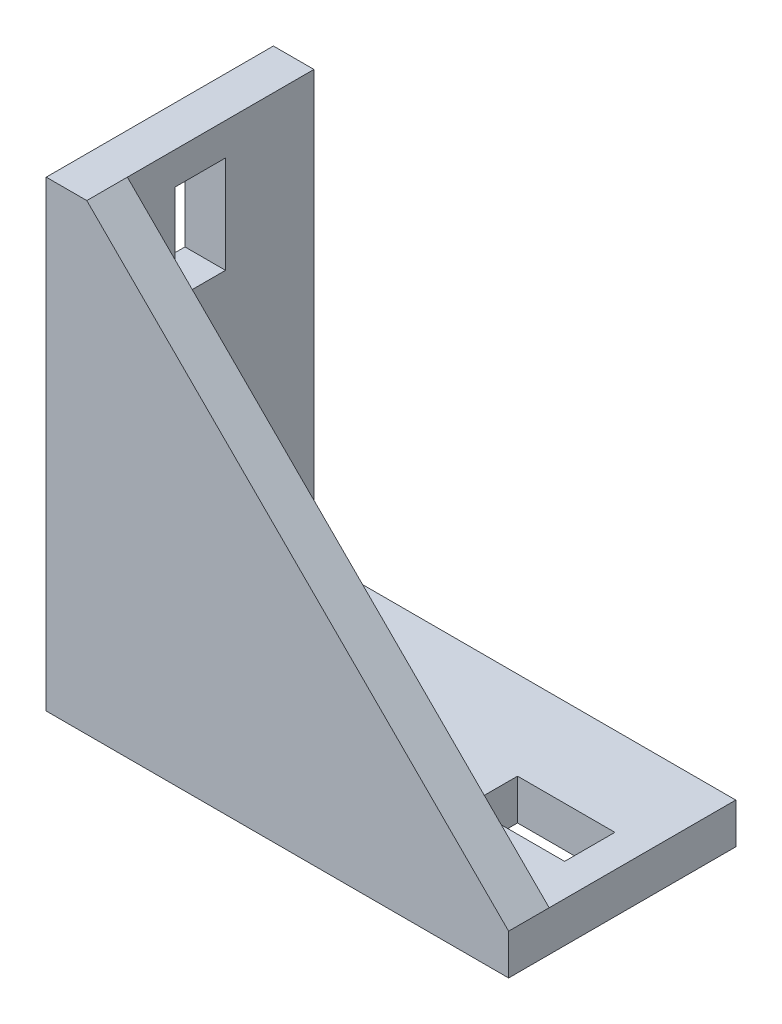
ISO-10303-21;
HEADER;
FILE_DESCRIPTION(('STEP AP214'),'2;1');
FILE_NAME('part.step','',(''),(''),'','','');
FILE_SCHEMA(('AUTOMOTIVE_DESIGN { 1 0 10303 214 1 1 1 1 }'));
ENDSEC;
DATA;
#1=APPLICATION_CONTEXT('core data for automotive mechanical design processes');
#2=APPLICATION_PROTOCOL_DEFINITION('international standard','automotive_design',2000,#1);
#3=PRODUCT_CONTEXT('',#1,'mechanical');
#4=PRODUCT('Part','Part','',(#3));
#5=PRODUCT_RELATED_PRODUCT_CATEGORY('part','',(#4));
#6=PRODUCT_DEFINITION_FORMATION('','',#4);
#7=PRODUCT_DEFINITION_CONTEXT('part definition',#1,'design');
#8=PRODUCT_DEFINITION('design','',#6,#7);
#9=PRODUCT_DEFINITION_SHAPE('','',#8);
#10=(LENGTH_UNIT() NAMED_UNIT(*) SI_UNIT(.MILLI.,.METRE.));
#11=(NAMED_UNIT(*) PLANE_ANGLE_UNIT() SI_UNIT($,.RADIAN.));
#12=(NAMED_UNIT(*) SI_UNIT($,.STERADIAN.) SOLID_ANGLE_UNIT());
#13=UNCERTAINTY_MEASURE_WITH_UNIT(LENGTH_MEASURE(1.E-05),#10,'distance_accuracy_value','');
#14=(GEOMETRIC_REPRESENTATION_CONTEXT(3) GLOBAL_UNCERTAINTY_ASSIGNED_CONTEXT((#13)) GLOBAL_UNIT_ASSIGNED_CONTEXT((#10,
#11,#12)) REPRESENTATION_CONTEXT('',''));
#15=CARTESIAN_POINT('',(0.,0.,0.));
#16=DIRECTION('',(0.,0.,1.));
#17=DIRECTION('',(1.,0.,0.));
#18=AXIS2_PLACEMENT_3D('',#15,#16,#17);
#19=CARTESIAN_POINT('',(5.00000000000001,5.,28.));
#20=DIRECTION('',(0.,-1.,0.));
#21=DIRECTION('',(0.,0.,-1.));
#22=AXIS2_PLACEMENT_3D('',#19,#20,#21);
#23=PLANE('',#22);
#24=DIRECTION('',(1.,0.,0.));
#25=VECTOR('',#24,1.);
#26=CARTESIAN_POINT('',(21.,5.,17.1));
#27=LINE('',#26,#25);
#28=CARTESIAN_POINT('',(9.00000000000001,5.,17.1));
#29=VERTEX_POINT('',#28);
#30=CARTESIAN_POINT('',(21.,5.,17.1));
#31=VERTEX_POINT('',#30);
#32=EDGE_CURVE('E214',#29,#31,#27,.T.);
#33=ORIENTED_EDGE('',*,*,#32,.F.);
#34=DIRECTION('',(0.,0.,1.));
#35=VECTOR('',#34,1.);
#36=CARTESIAN_POINT('',(9.00000000000001,5.,17.1));
#37=LINE('',#36,#35);
#38=CARTESIAN_POINT('',(9.00000000000001,5.,10.9));
#39=VERTEX_POINT('',#38);
#40=EDGE_CURVE('E47',#39,#29,#37,.T.);
#41=ORIENTED_EDGE('',*,*,#40,.F.);
#42=DIRECTION('',(-1.,0.,0.));
#43=VECTOR('',#42,1.);
#44=CARTESIAN_POINT('',(21.,5.,10.9));
#45=LINE('',#44,#43);
#46=CARTESIAN_POINT('',(21.,5.,10.9));
#47=VERTEX_POINT('',#46);
#48=EDGE_CURVE('E205',#47,#39,#45,.T.);
#49=ORIENTED_EDGE('',*,*,#48,.F.);
#50=DIRECTION('',(0.,0.,-1.));
#51=VECTOR('',#50,1.);
#52=CARTESIAN_POINT('',(21.,5.,17.1));
#53=LINE('',#52,#51);
#54=EDGE_CURVE('E208',#31,#47,#53,.T.);
#55=ORIENTED_EDGE('',*,*,#54,.F.);
#56=EDGE_LOOP('',(#33,#41,#49,#55));
#57=FACE_BOUND('',#56,.T.);
#58=DIRECTION('',(1.,0.,0.));
#59=VECTOR('',#58,1.);
#60=CARTESIAN_POINT('',(53.,5.,17.1));
#61=LINE('',#60,#59);
#62=CARTESIAN_POINT('',(41.,5.,17.1));
#63=VERTEX_POINT('',#62);
#64=CARTESIAN_POINT('',(53.,5.,17.1));
#65=VERTEX_POINT('',#64);
#66=EDGE_CURVE('E239',#63,#65,#61,.T.);
#67=ORIENTED_EDGE('',*,*,#66,.F.);
#68=DIRECTION('',(0.,0.,1.));
#69=VECTOR('',#68,1.);
#70=CARTESIAN_POINT('',(41.,5.,17.1));
#71=LINE('',#70,#69);
#72=CARTESIAN_POINT('',(41.,5.,10.9));
#73=VERTEX_POINT('',#72);
#74=EDGE_CURVE('E220',#73,#63,#71,.T.);
#75=ORIENTED_EDGE('',*,*,#74,.F.);
#76=DIRECTION('',(-1.,0.,0.));
#77=VECTOR('',#76,1.);
#78=CARTESIAN_POINT('',(53.,5.,10.9));
#79=LINE('',#78,#77);
#80=CARTESIAN_POINT('',(53.,5.,10.9));
#81=VERTEX_POINT('',#80);
#82=EDGE_CURVE('E228',#81,#73,#79,.T.);
#83=ORIENTED_EDGE('',*,*,#82,.F.);
#84=DIRECTION('',(0.,0.,-1.));
#85=VECTOR('',#84,1.);
#86=CARTESIAN_POINT('',(53.,5.,17.1));
#87=LINE('',#86,#85);
#88=EDGE_CURVE('E242',#65,#81,#87,.T.);
#89=ORIENTED_EDGE('',*,*,#88,.F.);
#90=EDGE_LOOP('',(#67,#75,#83,#89));
#91=FACE_BOUND('',#90,.T.);
#92=DIRECTION('',(1.,0.,0.));
#93=VECTOR('',#92,1.);
#94=CARTESIAN_POINT('',(5.00000000000001,5.,23.));
#95=LINE('',#94,#93);
#96=CARTESIAN_POINT('',(5.00000000000001,5.,23.));
#97=VERTEX_POINT('',#96);
#98=CARTESIAN_POINT('',(57.,5.,23.));
#99=VERTEX_POINT('',#98);
#100=EDGE_CURVE('E323',#97,#99,#95,.T.);
#101=ORIENTED_EDGE('',*,*,#100,.T.);
#102=DIRECTION('',(0.,0.,-1.));
#103=VECTOR('',#102,1.);
#104=CARTESIAN_POINT('',(57.,5.,28.));
#105=LINE('',#104,#103);
#106=CARTESIAN_POINT('',(57.,5.,0.));
#107=VERTEX_POINT('',#106);
#108=EDGE_CURVE('E366',#99,#107,#105,.T.);
#109=ORIENTED_EDGE('',*,*,#108,.T.);
#110=DIRECTION('',(-1.,0.,0.));
#111=VECTOR('',#110,1.);
#112=CARTESIAN_POINT('',(5.00000000000001,5.,0.));
#113=LINE('',#112,#111);
#114=CARTESIAN_POINT('',(5.00000000000001,5.,0.));
#115=VERTEX_POINT('',#114);
#116=EDGE_CURVE('E351',#107,#115,#113,.T.);
#117=ORIENTED_EDGE('',*,*,#116,.T.);
#118=DIRECTION('',(0.,0.,-1.));
#119=VECTOR('',#118,1.);
#120=CARTESIAN_POINT('',(5.00000000000001,5.,28.));
#121=LINE('',#120,#119);
#122=EDGE_CURVE('E364',#97,#115,#121,.T.);
#123=ORIENTED_EDGE('',*,*,#122,.F.);
#124=EDGE_LOOP('',(#101,#109,#117,#123));
#125=FACE_BOUND('',#124,.T.);
#126=ADVANCED_FACE('F32',(#57,#91,#125),#23,.F.);
#127=CARTESIAN_POINT('',(5.,57.,28.));
#128=DIRECTION('',(-1.,0.,0.));
#129=DIRECTION('',(0.,-1.,0.));
#130=AXIS2_PLACEMENT_3D('',#127,#128,#129);
#131=PLANE('',#130);
#132=DIRECTION('',(0.,0.,1.));
#133=VECTOR('',#132,1.);
#134=CARTESIAN_POINT('',(5.,21.,17.1));
#135=LINE('',#134,#133);
#136=CARTESIAN_POINT('',(5.,21.,10.9));
#137=VERTEX_POINT('',#136);
#138=CARTESIAN_POINT('',(5.,21.,17.1));
#139=VERTEX_POINT('',#138);
#140=EDGE_CURVE('E271',#137,#139,#135,.T.);
#141=ORIENTED_EDGE('',*,*,#140,.F.);
#142=DIRECTION('',(0.,1.,0.));
#143=VECTOR('',#142,1.);
#144=CARTESIAN_POINT('',(5.00000000000001,9.,10.9));
#145=LINE('',#144,#143);
#146=CARTESIAN_POINT('',(5.00000000000001,9.,10.9));
#147=VERTEX_POINT('',#146);
#148=EDGE_CURVE('E249',#147,#137,#145,.T.);
#149=ORIENTED_EDGE('',*,*,#148,.F.);
#150=DIRECTION('',(0.,0.,-1.));
#151=VECTOR('',#150,1.);
#152=CARTESIAN_POINT('',(5.00000000000001,9.,17.1));
#153=LINE('',#152,#151);
#154=CARTESIAN_POINT('',(5.00000000000001,9.,17.1));
#155=VERTEX_POINT('',#154);
#156=EDGE_CURVE('E260',#155,#147,#153,.T.);
#157=ORIENTED_EDGE('',*,*,#156,.F.);
#158=DIRECTION('',(0.,-1.,0.));
#159=VECTOR('',#158,1.);
#160=CARTESIAN_POINT('',(5.00000000000001,9.,17.1));
#161=LINE('',#160,#159);
#162=EDGE_CURVE('E274',#139,#155,#161,.T.);
#163=ORIENTED_EDGE('',*,*,#162,.F.);
#164=EDGE_LOOP('',(#141,#149,#157,#163));
#165=FACE_BOUND('',#164,.T.);
#166=DIRECTION('',(0.,0.,1.));
#167=VECTOR('',#166,1.);
#168=CARTESIAN_POINT('',(5.,53.,17.1));
#169=LINE('',#168,#167);
#170=CARTESIAN_POINT('',(5.,53.,10.9));
#171=VERTEX_POINT('',#170);
#172=CARTESIAN_POINT('',(5.,53.,17.1));
#173=VERTEX_POINT('',#172);
#174=EDGE_CURVE('E303',#171,#173,#169,.T.);
#175=ORIENTED_EDGE('',*,*,#174,.F.);
#176=DIRECTION('',(0.,1.,0.));
#177=VECTOR('',#176,1.);
#178=CARTESIAN_POINT('',(5.,41.,10.9));
#179=LINE('',#178,#177);
#180=CARTESIAN_POINT('',(5.,41.,10.9));
#181=VERTEX_POINT('',#180);
#182=EDGE_CURVE('E281',#181,#171,#179,.T.);
#183=ORIENTED_EDGE('',*,*,#182,.F.);
#184=DIRECTION('',(0.,0.,-1.));
#185=VECTOR('',#184,1.);
#186=CARTESIAN_POINT('',(5.,41.,17.1));
#187=LINE('',#186,#185);
#188=CARTESIAN_POINT('',(5.,41.,17.1));
#189=VERTEX_POINT('',#188);
#190=EDGE_CURVE('E292',#189,#181,#187,.T.);
#191=ORIENTED_EDGE('',*,*,#190,.F.);
#192=DIRECTION('',(0.,-1.,0.));
#193=VECTOR('',#192,1.);
#194=CARTESIAN_POINT('',(5.,41.,17.1));
#195=LINE('',#194,#193);
#196=EDGE_CURVE('E306',#173,#189,#195,.T.);
#197=ORIENTED_EDGE('',*,*,#196,.F.);
#198=EDGE_LOOP('',(#175,#183,#191,#197));
#199=FACE_BOUND('',#198,.T.);
#200=DIRECTION('',(0.,-1.,0.));
#201=VECTOR('',#200,1.);
#202=CARTESIAN_POINT('',(5.,57.,23.));
#203=LINE('',#202,#201);
#204=CARTESIAN_POINT('',(5.,57.,23.));
#205=VERTEX_POINT('',#204);
#206=EDGE_CURVE('E320',#205,#97,#203,.T.);
#207=ORIENTED_EDGE('',*,*,#206,.T.);
#208=ORIENTED_EDGE('',*,*,#122,.T.);
#209=DIRECTION('',(0.,1.,0.));
#210=VECTOR('',#209,1.);
#211=CARTESIAN_POINT('',(5.,57.,0.));
#212=LINE('',#211,#210);
#213=CARTESIAN_POINT('',(5.,57.,0.));
#214=VERTEX_POINT('',#213);
#215=EDGE_CURVE('E354',#115,#214,#212,.T.);
#216=ORIENTED_EDGE('',*,*,#215,.T.);
#217=DIRECTION('',(0.,0.,-1.));
#218=VECTOR('',#217,1.);
#219=CARTESIAN_POINT('',(5.,57.,28.));
#220=LINE('',#219,#218);
#221=EDGE_CURVE('E360',#205,#214,#220,.T.);
#222=ORIENTED_EDGE('',*,*,#221,.F.);
#223=EDGE_LOOP('',(#207,#208,#216,#222));
#224=FACE_BOUND('',#223,.T.);
#225=ADVANCED_FACE('F392',(#165,#199,#224),#131,.F.);
#226=CARTESIAN_POINT('',(0.,0.,28.));
#227=DIRECTION('',(1.,0.,0.));
#228=DIRECTION('',(0.,0.,-1.));
#229=AXIS2_PLACEMENT_3D('',#226,#227,#228);
#230=PLANE('',#229);
#231=DIRECTION('',(0.,0.,-1.));
#232=VECTOR('',#231,1.);
#233=CARTESIAN_POINT('',(0.,9.,17.1));
#234=LINE('',#233,#232);
#235=CARTESIAN_POINT('',(0.,9.,17.1));
#236=VERTEX_POINT('',#235);
#237=CARTESIAN_POINT('',(0.,9.,10.9));
#238=VERTEX_POINT('',#237);
#239=EDGE_CURVE('E266',#236,#238,#234,.T.);
#240=ORIENTED_EDGE('',*,*,#239,.T.);
#241=DIRECTION('',(0.,1.,0.));
#242=VECTOR('',#241,1.);
#243=CARTESIAN_POINT('',(0.,9.,10.9));
#244=LINE('',#243,#242);
#245=CARTESIAN_POINT('',(0.,21.,10.9));
#246=VERTEX_POINT('',#245);
#247=EDGE_CURVE('E256',#238,#246,#244,.T.);
#248=ORIENTED_EDGE('',*,*,#247,.T.);
#249=DIRECTION('',(0.,0.,1.));
#250=VECTOR('',#249,1.);
#251=CARTESIAN_POINT('',(0.,21.,17.1));
#252=LINE('',#251,#250);
#253=CARTESIAN_POINT('',(0.,21.,17.1));
#254=VERTEX_POINT('',#253);
#255=EDGE_CURVE('E259',#246,#254,#252,.T.);
#256=ORIENTED_EDGE('',*,*,#255,.T.);
#257=DIRECTION('',(0.,-1.,0.));
#258=VECTOR('',#257,1.);
#259=CARTESIAN_POINT('',(0.,9.,17.1));
#260=LINE('',#259,#258);
#261=EDGE_CURVE('E263',#254,#236,#260,.T.);
#262=ORIENTED_EDGE('',*,*,#261,.T.);
#263=EDGE_LOOP('',(#240,#248,#256,#262));
#264=FACE_BOUND('',#263,.T.);
#265=DIRECTION('',(0.,0.,-1.));
#266=VECTOR('',#265,1.);
#267=CARTESIAN_POINT('',(0.,41.,17.1));
#268=LINE('',#267,#266);
#269=CARTESIAN_POINT('',(0.,41.,17.1));
#270=VERTEX_POINT('',#269);
#271=CARTESIAN_POINT('',(0.,41.,10.9));
#272=VERTEX_POINT('',#271);
#273=EDGE_CURVE('E298',#270,#272,#268,.T.);
#274=ORIENTED_EDGE('',*,*,#273,.T.);
#275=DIRECTION('',(0.,1.,0.));
#276=VECTOR('',#275,1.);
#277=CARTESIAN_POINT('',(0.,41.,10.9));
#278=LINE('',#277,#276);
#279=CARTESIAN_POINT('',(0.,53.,10.9));
#280=VERTEX_POINT('',#279);
#281=EDGE_CURVE('E288',#272,#280,#278,.T.);
#282=ORIENTED_EDGE('',*,*,#281,.T.);
#283=DIRECTION('',(0.,0.,1.));
#284=VECTOR('',#283,1.);
#285=CARTESIAN_POINT('',(0.,53.,17.1));
#286=LINE('',#285,#284);
#287=CARTESIAN_POINT('',(0.,53.,17.1));
#288=VERTEX_POINT('',#287);
#289=EDGE_CURVE('E291',#280,#288,#286,.T.);
#290=ORIENTED_EDGE('',*,*,#289,.T.);
#291=DIRECTION('',(0.,-1.,0.));
#292=VECTOR('',#291,1.);
#293=CARTESIAN_POINT('',(0.,41.,17.1));
#294=LINE('',#293,#292);
#295=EDGE_CURVE('E295',#288,#270,#294,.T.);
#296=ORIENTED_EDGE('',*,*,#295,.T.);
#297=EDGE_LOOP('',(#274,#282,#290,#296));
#298=FACE_BOUND('',#297,.T.);
#299=DIRECTION('',(0.,-1.,0.));
#300=VECTOR('',#299,1.);
#301=CARTESIAN_POINT('',(0.,0.,0.));
#302=LINE('',#301,#300);
#303=CARTESIAN_POINT('',(0.,57.,0.));
#304=VERTEX_POINT('',#303);
#305=CARTESIAN_POINT('',(0.,0.,0.));
#306=VERTEX_POINT('',#305);
#307=EDGE_CURVE('E329',#304,#306,#302,.T.);
#308=ORIENTED_EDGE('',*,*,#307,.T.);
#309=DIRECTION('',(0.,0.,-1.));
#310=VECTOR('',#309,1.);
#311=CARTESIAN_POINT('',(0.,0.,28.));
#312=LINE('',#311,#310);
#313=CARTESIAN_POINT('',(0.,0.,28.));
#314=VERTEX_POINT('',#313);
#315=EDGE_CURVE('E11',#314,#306,#312,.T.);
#316=ORIENTED_EDGE('',*,*,#315,.F.);
#317=DIRECTION('',(0.,-1.,0.));
#318=VECTOR('',#317,1.);
#319=CARTESIAN_POINT('',(0.,0.,28.));
#320=LINE('',#319,#318);
#321=CARTESIAN_POINT('',(0.,57.,28.));
#322=VERTEX_POINT('',#321);
#323=EDGE_CURVE('E332',#322,#314,#320,.T.);
#324=ORIENTED_EDGE('',*,*,#323,.F.);
#325=DIRECTION('',(0.,0.,-1.));
#326=VECTOR('',#325,1.);
#327=CARTESIAN_POINT('',(0.,57.,28.));
#328=LINE('',#327,#326);
#329=EDGE_CURVE('E343',#322,#304,#328,.T.);
#330=ORIENTED_EDGE('',*,*,#329,.T.);
#331=EDGE_LOOP('',(#308,#316,#324,#330));
#332=FACE_BOUND('',#331,.T.);
#333=ADVANCED_FACE('F34',(#264,#298,#332),#230,.F.);
#334=CARTESIAN_POINT('',(0.,0.,28.));
#335=DIRECTION('',(0.,1.,0.));
#336=DIRECTION('',(0.,0.,1.));
#337=AXIS2_PLACEMENT_3D('',#334,#335,#336);
#338=PLANE('',#337);
#339=DIRECTION('',(-1.,0.,0.));
#340=VECTOR('',#339,1.);
#341=CARTESIAN_POINT('',(21.,0.,10.9));
#342=LINE('',#341,#340);
#343=CARTESIAN_POINT('',(21.,0.,10.9));
#344=VERTEX_POINT('',#343);
#345=CARTESIAN_POINT('',(9.00000000000001,0.,10.9));
#346=VERTEX_POINT('',#345);
#347=EDGE_CURVE('E195',#344,#346,#342,.T.);
#348=ORIENTED_EDGE('',*,*,#347,.T.);
#349=DIRECTION('',(0.,0.,1.));
#350=VECTOR('',#349,1.);
#351=CARTESIAN_POINT('',(9.00000000000001,0.,17.1));
#352=LINE('',#351,#350);
#353=CARTESIAN_POINT('',(9.00000000000001,0.,17.1));
#354=VERTEX_POINT('',#353);
#355=EDGE_CURVE('E189',#346,#354,#352,.T.);
#356=ORIENTED_EDGE('',*,*,#355,.T.);
#357=DIRECTION('',(1.,0.,0.));
#358=VECTOR('',#357,1.);
#359=CARTESIAN_POINT('',(21.,0.,17.1));
#360=LINE('',#359,#358);
#361=CARTESIAN_POINT('',(21.,0.,17.1));
#362=VERTEX_POINT('',#361);
#363=EDGE_CURVE('E198',#354,#362,#360,.T.);
#364=ORIENTED_EDGE('',*,*,#363,.T.);
#365=DIRECTION('',(0.,0.,-1.));
#366=VECTOR('',#365,1.);
#367=CARTESIAN_POINT('',(21.,0.,17.1));
#368=LINE('',#367,#366);
#369=EDGE_CURVE('E55',#362,#344,#368,.T.);
#370=ORIENTED_EDGE('',*,*,#369,.T.);
#371=EDGE_LOOP('',(#348,#356,#364,#370));
#372=FACE_BOUND('',#371,.T.);
#373=DIRECTION('',(-1.,0.,0.));
#374=VECTOR('',#373,1.);
#375=CARTESIAN_POINT('',(53.,0.,10.9));
#376=LINE('',#375,#374);
#377=CARTESIAN_POINT('',(53.,0.,10.9));
#378=VERTEX_POINT('',#377);
#379=CARTESIAN_POINT('',(41.,0.,10.9));
#380=VERTEX_POINT('',#379);
#381=EDGE_CURVE('E234',#378,#380,#376,.T.);
#382=ORIENTED_EDGE('',*,*,#381,.T.);
#383=DIRECTION('',(0.,0.,1.));
#384=VECTOR('',#383,1.);
#385=CARTESIAN_POINT('',(41.,0.,17.1));
#386=LINE('',#385,#384);
#387=CARTESIAN_POINT('',(41.,0.,17.1));
#388=VERTEX_POINT('',#387);
#389=EDGE_CURVE('E224',#380,#388,#386,.T.);
#390=ORIENTED_EDGE('',*,*,#389,.T.);
#391=DIRECTION('',(1.,0.,0.));
#392=VECTOR('',#391,1.);
#393=CARTESIAN_POINT('',(53.,0.,17.1));
#394=LINE('',#393,#392);
#395=CARTESIAN_POINT('',(53.,0.,17.1));
#396=VERTEX_POINT('',#395);
#397=EDGE_CURVE('E227',#388,#396,#394,.T.);
#398=ORIENTED_EDGE('',*,*,#397,.T.);
#399=DIRECTION('',(0.,0.,-1.));
#400=VECTOR('',#399,1.);
#401=CARTESIAN_POINT('',(53.,0.,17.1));
#402=LINE('',#401,#400);
#403=EDGE_CURVE('E231',#396,#378,#402,.T.);
#404=ORIENTED_EDGE('',*,*,#403,.T.);
#405=EDGE_LOOP('',(#382,#390,#398,#404));
#406=FACE_BOUND('',#405,.T.);
#407=DIRECTION('',(1.,0.,0.));
#408=VECTOR('',#407,1.);
#409=CARTESIAN_POINT('',(0.,0.,0.));
#410=LINE('',#409,#408);
#411=CARTESIAN_POINT('',(57.,0.,0.));
#412=VERTEX_POINT('',#411);
#413=EDGE_CURVE('E346',#306,#412,#410,.T.);
#414=ORIENTED_EDGE('',*,*,#413,.T.);
#415=DIRECTION('',(0.,0.,-1.));
#416=VECTOR('',#415,1.);
#417=CARTESIAN_POINT('',(57.,0.,28.));
#418=LINE('',#417,#416);
#419=CARTESIAN_POINT('',(57.,0.,28.));
#420=VERTEX_POINT('',#419);
#421=EDGE_CURVE('E40',#420,#412,#418,.T.);
#422=ORIENTED_EDGE('',*,*,#421,.F.);
#423=DIRECTION('',(1.,0.,0.));
#424=VECTOR('',#423,1.);
#425=CARTESIAN_POINT('',(0.,0.,28.));
#426=LINE('',#425,#424);
#427=EDGE_CURVE('E335',#314,#420,#426,.T.);
#428=ORIENTED_EDGE('',*,*,#427,.F.);
#429=ORIENTED_EDGE('',*,*,#315,.T.);
#430=EDGE_LOOP('',(#414,#422,#428,#429));
#431=FACE_BOUND('',#430,.T.);
#432=ADVANCED_FACE('F202',(#372,#406,#431),#338,.F.);
#433=CARTESIAN_POINT('',(57.,5.,28.));
#434=DIRECTION('',(-1.,0.,0.));
#435=DIRECTION('',(0.,-1.,0.));
#436=AXIS2_PLACEMENT_3D('',#433,#434,#435);
#437=PLANE('',#436);
#438=DIRECTION('',(0.,1.,0.));
#439=VECTOR('',#438,1.);
#440=CARTESIAN_POINT('',(57.,5.,0.));
#441=LINE('',#440,#439);
#442=EDGE_CURVE('E348',#412,#107,#441,.T.);
#443=ORIENTED_EDGE('',*,*,#442,.T.);
#444=ORIENTED_EDGE('',*,*,#108,.F.);
#445=CARTESIAN_POINT('',(57.,5.,28.));
#446=VERTEX_POINT('',#445);
#447=EDGE_CURVE('E367',#446,#99,#105,.T.);
#448=ORIENTED_EDGE('',*,*,#447,.F.);
#449=DIRECTION('',(0.,1.,0.));
#450=VECTOR('',#449,1.);
#451=CARTESIAN_POINT('',(57.,5.,28.));
#452=LINE('',#451,#450);
#453=EDGE_CURVE('E338',#420,#446,#452,.T.);
#454=ORIENTED_EDGE('',*,*,#453,.F.);
#455=ORIENTED_EDGE('',*,*,#421,.T.);
#456=EDGE_LOOP('',(#443,#444,#448,#454,#455));
#457=FACE_BOUND('',#456,.T.);
#458=ADVANCED_FACE('F373',(#457),#437,.F.);
#459=CARTESIAN_POINT('',(0.,57.,28.));
#460=DIRECTION('',(0.,-1.,0.));
#461=DIRECTION('',(0.,0.,-1.));
#462=AXIS2_PLACEMENT_3D('',#459,#460,#461);
#463=PLANE('',#462);
#464=DIRECTION('',(-1.,0.,0.));
#465=VECTOR('',#464,1.);
#466=CARTESIAN_POINT('',(0.,57.,0.));
#467=LINE('',#466,#465);
#468=EDGE_CURVE('E336',#214,#304,#467,.T.);
#469=ORIENTED_EDGE('',*,*,#468,.T.);
#470=ORIENTED_EDGE('',*,*,#329,.F.);
#471=DIRECTION('',(-1.,0.,0.));
#472=VECTOR('',#471,1.);
#473=CARTESIAN_POINT('',(0.,57.,28.));
#474=LINE('',#473,#472);
#475=CARTESIAN_POINT('',(5.,57.,28.));
#476=VERTEX_POINT('',#475);
#477=EDGE_CURVE('E341',#476,#322,#474,.T.);
#478=ORIENTED_EDGE('',*,*,#477,.F.);
#479=EDGE_CURVE('E361',#476,#205,#220,.T.);
#480=ORIENTED_EDGE('',*,*,#479,.T.);
#481=ORIENTED_EDGE('',*,*,#221,.T.);
#482=EDGE_LOOP('',(#469,#470,#478,#480,#481));
#483=FACE_BOUND('',#482,.T.);
#484=ADVANCED_FACE('F395',(#483),#463,.F.);
#485=CARTESIAN_POINT('',(0.,0.,28.));
#486=DIRECTION('',(0.,0.,-1.));
#487=DIRECTION('',(-1.,0.,0.));
#488=AXIS2_PLACEMENT_3D('',#485,#486,#487);
#489=PLANE('',#488);
#490=DIRECTION('',(-0.707106781186548,0.707106781186548,0.));
#491=VECTOR('',#490,1.);
#492=CARTESIAN_POINT('',(5.,57.,28.));
#493=LINE('',#492,#491);
#494=EDGE_CURVE('E313',#446,#476,#493,.T.);
#495=ORIENTED_EDGE('',*,*,#494,.T.);
#496=ORIENTED_EDGE('',*,*,#477,.T.);
#497=ORIENTED_EDGE('',*,*,#323,.T.);
#498=ORIENTED_EDGE('',*,*,#427,.T.);
#499=ORIENTED_EDGE('',*,*,#453,.T.);
#500=EDGE_LOOP('',(#495,#496,#497,#498,#499));
#501=FACE_BOUND('',#500,.T.);
#502=ADVANCED_FACE('F398',(#501),#489,.F.);
#503=CARTESIAN_POINT('',(0.,0.,0.));
#504=DIRECTION('',(0.,0.,-1.));
#505=DIRECTION('',(-1.,0.,0.));
#506=AXIS2_PLACEMENT_3D('',#503,#504,#505);
#507=PLANE('',#506);
#508=ORIENTED_EDGE('',*,*,#307,.F.);
#509=ORIENTED_EDGE('',*,*,#468,.F.);
#510=ORIENTED_EDGE('',*,*,#215,.F.);
#511=ORIENTED_EDGE('',*,*,#116,.F.);
#512=ORIENTED_EDGE('',*,*,#442,.F.);
#513=ORIENTED_EDGE('',*,*,#413,.F.);
#514=EDGE_LOOP('',(#508,#509,#510,#511,#512,#513));
#515=FACE_BOUND('',#514,.T.);
#516=ADVANCED_FACE('F380',(#515),#507,.T.);
#517=CARTESIAN_POINT('',(5.,57.,23.));
#518=DIRECTION('',(0.707106781186548,0.707106781186548,0.));
#519=DIRECTION('',(-0.707106781186548,0.707106781186548,0.));
#520=AXIS2_PLACEMENT_3D('',#517,#518,#519);
#521=PLANE('',#520);
#522=ORIENTED_EDGE('',*,*,#494,.F.);
#523=ORIENTED_EDGE('',*,*,#447,.T.);
#524=DIRECTION('',(-0.707106781186548,0.707106781186548,0.));
#525=VECTOR('',#524,1.);
#526=CARTESIAN_POINT('',(5.,57.,23.));
#527=LINE('',#526,#525);
#528=EDGE_CURVE('E326',#99,#205,#527,.T.);
#529=ORIENTED_EDGE('',*,*,#528,.T.);
#530=ORIENTED_EDGE('',*,*,#479,.F.);
#531=EDGE_LOOP('',(#522,#523,#529,#530));
#532=FACE_BOUND('',#531,.T.);
#533=ADVANCED_FACE('F387',(#532),#521,.T.);
#534=CARTESIAN_POINT('',(0.,0.,23.));
#535=DIRECTION('',(0.,0.,1.));
#536=DIRECTION('',(1.,0.,0.));
#537=AXIS2_PLACEMENT_3D('',#534,#535,#536);
#538=PLANE('',#537);
#539=ORIENTED_EDGE('',*,*,#206,.F.);
#540=ORIENTED_EDGE('',*,*,#528,.F.);
#541=ORIENTED_EDGE('',*,*,#100,.F.);
#542=EDGE_LOOP('',(#539,#540,#541));
#543=FACE_BOUND('',#542,.T.);
#544=ADVANCED_FACE('F390',(#543),#538,.F.);
#545=CARTESIAN_POINT('',(0.,41.,10.9));
#546=DIRECTION('',(0.,0.,-1.));
#547=DIRECTION('',(-1.,0.,0.));
#548=AXIS2_PLACEMENT_3D('',#545,#546,#547);
#549=PLANE('',#548);
#550=ORIENTED_EDGE('',*,*,#182,.T.);
#551=DIRECTION('',(1.,0.,0.));
#552=VECTOR('',#551,1.);
#553=CARTESIAN_POINT('',(0.,53.,10.9));
#554=LINE('',#553,#552);
#555=EDGE_CURVE('E301',#280,#171,#554,.T.);
#556=ORIENTED_EDGE('',*,*,#555,.F.);
#557=ORIENTED_EDGE('',*,*,#281,.F.);
#558=DIRECTION('',(1.,0.,0.));
#559=VECTOR('',#558,1.);
#560=CARTESIAN_POINT('',(0.,41.,10.9));
#561=LINE('',#560,#559);
#562=EDGE_CURVE('E311',#272,#181,#561,.T.);
#563=ORIENTED_EDGE('',*,*,#562,.T.);
#564=EDGE_LOOP('',(#550,#556,#557,#563));
#565=FACE_BOUND('',#564,.T.);
#566=ADVANCED_FACE('F434',(#565),#549,.F.);
#567=CARTESIAN_POINT('',(0.,41.,17.1));
#568=DIRECTION('',(0.,-1.,0.));
#569=DIRECTION('',(1.,0.,0.));
#570=AXIS2_PLACEMENT_3D('',#567,#568,#569);
#571=PLANE('',#570);
#572=ORIENTED_EDGE('',*,*,#190,.T.);
#573=ORIENTED_EDGE('',*,*,#562,.F.);
#574=ORIENTED_EDGE('',*,*,#273,.F.);
#575=DIRECTION('',(1.,0.,0.));
#576=VECTOR('',#575,1.);
#577=CARTESIAN_POINT('',(0.,41.,17.1));
#578=LINE('',#577,#576);
#579=EDGE_CURVE('E314',#270,#189,#578,.T.);
#580=ORIENTED_EDGE('',*,*,#579,.T.);
#581=EDGE_LOOP('',(#572,#573,#574,#580));
#582=FACE_BOUND('',#581,.T.);
#583=ADVANCED_FACE('F437',(#582),#571,.F.);
#584=CARTESIAN_POINT('',(0.,41.,17.1));
#585=DIRECTION('',(0.,0.,1.));
#586=DIRECTION('',(1.,0.,0.));
#587=AXIS2_PLACEMENT_3D('',#584,#585,#586);
#588=PLANE('',#587);
#589=ORIENTED_EDGE('',*,*,#196,.T.);
#590=ORIENTED_EDGE('',*,*,#579,.F.);
#591=ORIENTED_EDGE('',*,*,#295,.F.);
#592=DIRECTION('',(1.,0.,0.));
#593=VECTOR('',#592,1.);
#594=CARTESIAN_POINT('',(0.,53.,17.1));
#595=LINE('',#594,#593);
#596=EDGE_CURVE('E316',#288,#173,#595,.T.);
#597=ORIENTED_EDGE('',*,*,#596,.T.);
#598=EDGE_LOOP('',(#589,#590,#591,#597));
#599=FACE_BOUND('',#598,.T.);
#600=ADVANCED_FACE('F443',(#599),#588,.F.);
#601=CARTESIAN_POINT('',(0.,53.,17.1));
#602=DIRECTION('',(0.,1.,0.));
#603=DIRECTION('',(-1.,0.,0.));
#604=AXIS2_PLACEMENT_3D('',#601,#602,#603);
#605=PLANE('',#604);
#606=ORIENTED_EDGE('',*,*,#174,.T.);
#607=ORIENTED_EDGE('',*,*,#596,.F.);
#608=ORIENTED_EDGE('',*,*,#289,.F.);
#609=ORIENTED_EDGE('',*,*,#555,.T.);
#610=EDGE_LOOP('',(#606,#607,#608,#609));
#611=FACE_BOUND('',#610,.T.);
#612=ADVANCED_FACE('F439',(#611),#605,.F.);
#613=CARTESIAN_POINT('',(0.,9.,10.9));
#614=DIRECTION('',(0.,0.,-1.));
#615=DIRECTION('',(-1.,0.,0.));
#616=AXIS2_PLACEMENT_3D('',#613,#614,#615);
#617=PLANE('',#616);
#618=ORIENTED_EDGE('',*,*,#148,.T.);
#619=DIRECTION('',(1.,0.,0.));
#620=VECTOR('',#619,1.);
#621=CARTESIAN_POINT('',(0.,21.,10.9));
#622=LINE('',#621,#620);
#623=EDGE_CURVE('E269',#246,#137,#622,.T.);
#624=ORIENTED_EDGE('',*,*,#623,.F.);
#625=ORIENTED_EDGE('',*,*,#247,.F.);
#626=DIRECTION('',(1.,0.,0.));
#627=VECTOR('',#626,1.);
#628=CARTESIAN_POINT('',(0.,9.,10.9));
#629=LINE('',#628,#627);
#630=EDGE_CURVE('E279',#238,#147,#629,.T.);
#631=ORIENTED_EDGE('',*,*,#630,.T.);
#632=EDGE_LOOP('',(#618,#624,#625,#631));
#633=FACE_BOUND('',#632,.T.);
#634=ADVANCED_FACE('F442',(#633),#617,.F.);
#635=CARTESIAN_POINT('',(0.,9.,17.1));
#636=DIRECTION('',(0.,-1.,0.));
#637=DIRECTION('',(1.,0.,0.));
#638=AXIS2_PLACEMENT_3D('',#635,#636,#637);
#639=PLANE('',#638);
#640=ORIENTED_EDGE('',*,*,#156,.T.);
#641=ORIENTED_EDGE('',*,*,#630,.F.);
#642=ORIENTED_EDGE('',*,*,#239,.F.);
#643=DIRECTION('',(1.,0.,0.));
#644=VECTOR('',#643,1.);
#645=CARTESIAN_POINT('',(0.,9.,17.1));
#646=LINE('',#645,#644);
#647=EDGE_CURVE('E282',#236,#155,#646,.T.);
#648=ORIENTED_EDGE('',*,*,#647,.T.);
#649=EDGE_LOOP('',(#640,#641,#642,#648));
#650=FACE_BOUND('',#649,.T.);
#651=ADVANCED_FACE('F453',(#650),#639,.F.);
#652=CARTESIAN_POINT('',(0.,9.,17.1));
#653=DIRECTION('',(0.,0.,1.));
#654=DIRECTION('',(1.,0.,0.));
#655=AXIS2_PLACEMENT_3D('',#652,#653,#654);
#656=PLANE('',#655);
#657=ORIENTED_EDGE('',*,*,#162,.T.);
#658=ORIENTED_EDGE('',*,*,#647,.F.);
#659=ORIENTED_EDGE('',*,*,#261,.F.);
#660=DIRECTION('',(1.,0.,0.));
#661=VECTOR('',#660,1.);
#662=CARTESIAN_POINT('',(0.,21.,17.1));
#663=LINE('',#662,#661);
#664=EDGE_CURVE('E284',#254,#139,#663,.T.);
#665=ORIENTED_EDGE('',*,*,#664,.T.);
#666=EDGE_LOOP('',(#657,#658,#659,#665));
#667=FACE_BOUND('',#666,.T.);
#668=ADVANCED_FACE('F459',(#667),#656,.F.);
#669=CARTESIAN_POINT('',(0.,21.,17.1));
#670=DIRECTION('',(0.,1.,0.));
#671=DIRECTION('',(-1.,0.,0.));
#672=AXIS2_PLACEMENT_3D('',#669,#670,#671);
#673=PLANE('',#672);
#674=ORIENTED_EDGE('',*,*,#140,.T.);
#675=ORIENTED_EDGE('',*,*,#664,.F.);
#676=ORIENTED_EDGE('',*,*,#255,.F.);
#677=ORIENTED_EDGE('',*,*,#623,.T.);
#678=EDGE_LOOP('',(#674,#675,#676,#677));
#679=FACE_BOUND('',#678,.T.);
#680=ADVANCED_FACE('F455',(#679),#673,.F.);
#681=CARTESIAN_POINT('',(41.,0.,17.1));
#682=DIRECTION('',(-1.,0.,0.));
#683=DIRECTION('',(0.,0.,1.));
#684=AXIS2_PLACEMENT_3D('',#681,#682,#683);
#685=PLANE('',#684);
#686=ORIENTED_EDGE('',*,*,#74,.T.);
#687=DIRECTION('',(0.,1.,0.));
#688=VECTOR('',#687,1.);
#689=CARTESIAN_POINT('',(41.,0.,17.1));
#690=LINE('',#689,#688);
#691=EDGE_CURVE('E237',#388,#63,#690,.T.);
#692=ORIENTED_EDGE('',*,*,#691,.F.);
#693=ORIENTED_EDGE('',*,*,#389,.F.);
#694=DIRECTION('',(0.,1.,0.));
#695=VECTOR('',#694,1.);
#696=CARTESIAN_POINT('',(41.,0.,10.9));
#697=LINE('',#696,#695);
#698=EDGE_CURVE('E247',#380,#73,#697,.T.);
#699=ORIENTED_EDGE('',*,*,#698,.T.);
#700=EDGE_LOOP('',(#686,#692,#693,#699));
#701=FACE_BOUND('',#700,.T.);
#702=ADVANCED_FACE('F458',(#701),#685,.F.);
#703=CARTESIAN_POINT('',(53.,0.,10.9));
#704=DIRECTION('',(0.,0.,-1.));
#705=DIRECTION('',(-1.,0.,0.));
#706=AXIS2_PLACEMENT_3D('',#703,#704,#705);
#707=PLANE('',#706);
#708=ORIENTED_EDGE('',*,*,#82,.T.);
#709=ORIENTED_EDGE('',*,*,#698,.F.);
#710=ORIENTED_EDGE('',*,*,#381,.F.);
#711=DIRECTION('',(0.,1.,0.));
#712=VECTOR('',#711,1.);
#713=CARTESIAN_POINT('',(53.,0.,10.9));
#714=LINE('',#713,#712);
#715=EDGE_CURVE('E250',#378,#81,#714,.T.);
#716=ORIENTED_EDGE('',*,*,#715,.T.);
#717=EDGE_LOOP('',(#708,#709,#710,#716));
#718=FACE_BOUND('',#717,.T.);
#719=ADVANCED_FACE('F469',(#718),#707,.F.);
#720=CARTESIAN_POINT('',(53.,0.,17.1));
#721=DIRECTION('',(1.,0.,0.));
#722=DIRECTION('',(0.,0.,-1.));
#723=AXIS2_PLACEMENT_3D('',#720,#721,#722);
#724=PLANE('',#723);
#725=ORIENTED_EDGE('',*,*,#88,.T.);
#726=ORIENTED_EDGE('',*,*,#715,.F.);
#727=ORIENTED_EDGE('',*,*,#403,.F.);
#728=DIRECTION('',(0.,1.,0.));
#729=VECTOR('',#728,1.);
#730=CARTESIAN_POINT('',(53.,0.,17.1));
#731=LINE('',#730,#729);
#732=EDGE_CURVE('E252',#396,#65,#731,.T.);
#733=ORIENTED_EDGE('',*,*,#732,.T.);
#734=EDGE_LOOP('',(#725,#726,#727,#733));
#735=FACE_BOUND('',#734,.T.);
#736=ADVANCED_FACE('F474',(#735),#724,.F.);
#737=CARTESIAN_POINT('',(53.,0.,17.1));
#738=DIRECTION('',(0.,0.,1.));
#739=DIRECTION('',(1.,0.,0.));
#740=AXIS2_PLACEMENT_3D('',#737,#738,#739);
#741=PLANE('',#740);
#742=ORIENTED_EDGE('',*,*,#66,.T.);
#743=ORIENTED_EDGE('',*,*,#732,.F.);
#744=ORIENTED_EDGE('',*,*,#397,.F.);
#745=ORIENTED_EDGE('',*,*,#691,.T.);
#746=EDGE_LOOP('',(#742,#743,#744,#745));
#747=FACE_BOUND('',#746,.T.);
#748=ADVANCED_FACE('F471',(#747),#741,.F.);
#749=CARTESIAN_POINT('',(9.00000000000001,0.,17.1));
#750=DIRECTION('',(-1.,0.,0.));
#751=DIRECTION('',(0.,0.,1.));
#752=AXIS2_PLACEMENT_3D('',#749,#750,#751);
#753=PLANE('',#752);
#754=ORIENTED_EDGE('',*,*,#40,.T.);
#755=DIRECTION('',(0.,1.,0.));
#756=VECTOR('',#755,1.);
#757=CARTESIAN_POINT('',(9.00000000000001,0.,17.1));
#758=LINE('',#757,#756);
#759=EDGE_CURVE('E185',#354,#29,#758,.T.);
#760=ORIENTED_EDGE('',*,*,#759,.F.);
#761=ORIENTED_EDGE('',*,*,#355,.F.);
#762=DIRECTION('',(0.,1.,0.));
#763=VECTOR('',#762,1.);
#764=CARTESIAN_POINT('',(9.00000000000001,0.,10.9));
#765=LINE('',#764,#763);
#766=EDGE_CURVE('E218',#346,#39,#765,.T.);
#767=ORIENTED_EDGE('',*,*,#766,.T.);
#768=EDGE_LOOP('',(#754,#760,#761,#767));
#769=FACE_BOUND('',#768,.T.);
#770=ADVANCED_FACE('F187',(#769),#753,.F.);
#771=CARTESIAN_POINT('',(21.,0.,10.9));
#772=DIRECTION('',(0.,0.,-1.));
#773=DIRECTION('',(-1.,0.,0.));
#774=AXIS2_PLACEMENT_3D('',#771,#772,#773);
#775=PLANE('',#774);
#776=ORIENTED_EDGE('',*,*,#48,.T.);
#777=ORIENTED_EDGE('',*,*,#766,.F.);
#778=ORIENTED_EDGE('',*,*,#347,.F.);
#779=DIRECTION('',(0.,1.,0.));
#780=VECTOR('',#779,1.);
#781=CARTESIAN_POINT('',(21.,0.,10.9));
#782=LINE('',#781,#780);
#783=EDGE_CURVE('E221',#344,#47,#782,.T.);
#784=ORIENTED_EDGE('',*,*,#783,.T.);
#785=EDGE_LOOP('',(#776,#777,#778,#784));
#786=FACE_BOUND('',#785,.T.);
#787=ADVANCED_FACE('F484',(#786),#775,.F.);
#788=CARTESIAN_POINT('',(21.,0.,17.1));
#789=DIRECTION('',(1.,0.,0.));
#790=DIRECTION('',(0.,0.,-1.));
#791=AXIS2_PLACEMENT_3D('',#788,#789,#790);
#792=PLANE('',#791);
#793=ORIENTED_EDGE('',*,*,#54,.T.);
#794=ORIENTED_EDGE('',*,*,#783,.F.);
#795=ORIENTED_EDGE('',*,*,#369,.F.);
#796=DIRECTION('',(0.,1.,0.));
#797=VECTOR('',#796,1.);
#798=CARTESIAN_POINT('',(21.,0.,17.1));
#799=LINE('',#798,#797);
#800=EDGE_CURVE('E194',#362,#31,#799,.T.);
#801=ORIENTED_EDGE('',*,*,#800,.T.);
#802=EDGE_LOOP('',(#793,#794,#795,#801));
#803=FACE_BOUND('',#802,.T.);
#804=ADVANCED_FACE('F487',(#803),#792,.F.);
#805=CARTESIAN_POINT('',(21.,0.,17.1));
#806=DIRECTION('',(0.,0.,1.));
#807=DIRECTION('',(1.,0.,0.));
#808=AXIS2_PLACEMENT_3D('',#805,#806,#807);
#809=PLANE('',#808);
#810=ORIENTED_EDGE('',*,*,#32,.T.);
#811=ORIENTED_EDGE('',*,*,#800,.F.);
#812=ORIENTED_EDGE('',*,*,#363,.F.);
#813=ORIENTED_EDGE('',*,*,#759,.T.);
#814=EDGE_LOOP('',(#810,#811,#812,#813));
#815=FACE_BOUND('',#814,.T.);
#816=ADVANCED_FACE('F199',(#815),#809,.F.);
#817=CLOSED_SHELL('',(#126,#225,#333,#432,#458,#484,#502,#516,#533,#544,#566,#583,#600,#612,
#634,#651,#668,#680,#702,#719,#736,#748,#770,#787,#804,#816));
#818=MANIFOLD_SOLID_BREP('B2',#817);
#819=ADVANCED_BREP_SHAPE_REPRESENTATION('',(#18,#818),#14);
#820=SHAPE_DEFINITION_REPRESENTATION(#9,#819);
ENDSEC;
END-ISO-10303-21;
